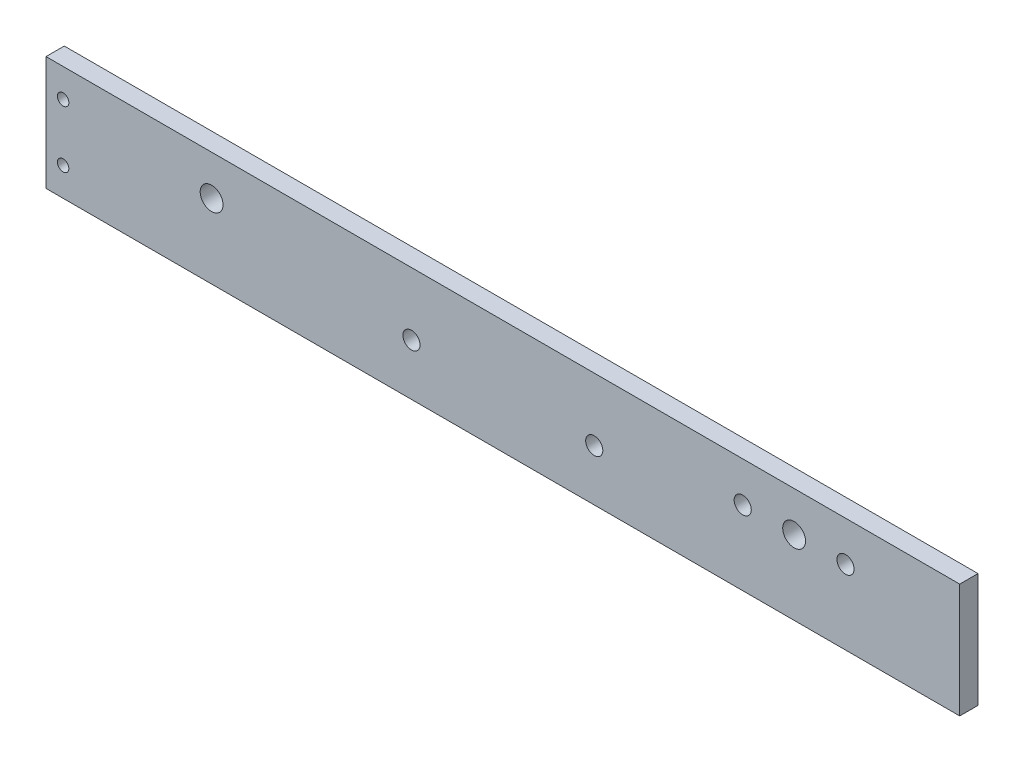
ISO-10303-21;
HEADER;
FILE_DESCRIPTION(('STEP AP214'),'2;1');
FILE_NAME('part.step','',(''),(''),'','','');
FILE_SCHEMA(('AUTOMOTIVE_DESIGN { 1 0 10303 214 1 1 1 1 }'));
ENDSEC;
DATA;
#1=APPLICATION_CONTEXT('core data for automotive mechanical design processes');
#2=APPLICATION_PROTOCOL_DEFINITION('international standard','automotive_design',2000,#1);
#3=PRODUCT_CONTEXT('',#1,'mechanical');
#4=PRODUCT('Part','Part','',(#3));
#5=PRODUCT_RELATED_PRODUCT_CATEGORY('part','',(#4));
#6=PRODUCT_DEFINITION_FORMATION('','',#4);
#7=PRODUCT_DEFINITION_CONTEXT('part definition',#1,'design');
#8=PRODUCT_DEFINITION('design','',#6,#7);
#9=PRODUCT_DEFINITION_SHAPE('','',#8);
#10=(LENGTH_UNIT() NAMED_UNIT(*) SI_UNIT(.MILLI.,.METRE.));
#11=(NAMED_UNIT(*) PLANE_ANGLE_UNIT() SI_UNIT($,.RADIAN.));
#12=(NAMED_UNIT(*) SI_UNIT($,.STERADIAN.) SOLID_ANGLE_UNIT());
#13=UNCERTAINTY_MEASURE_WITH_UNIT(LENGTH_MEASURE(1.E-05),#10,'distance_accuracy_value','');
#14=(GEOMETRIC_REPRESENTATION_CONTEXT(3) GLOBAL_UNCERTAINTY_ASSIGNED_CONTEXT((#13)) GLOBAL_UNIT_ASSIGNED_CONTEXT((#10,
#11,#12)) REPRESENTATION_CONTEXT('',''));
#15=CARTESIAN_POINT('',(0.,0.,0.));
#16=DIRECTION('',(0.,0.,1.));
#17=DIRECTION('',(1.,0.,0.));
#18=AXIS2_PLACEMENT_3D('',#15,#16,#17);
#19=CARTESIAN_POINT('',(0.,0.,6.8));
#20=DIRECTION('',(1.,0.,0.));
#21=DIRECTION('',(0.,0.,-1.));
#22=AXIS2_PLACEMENT_3D('',#19,#20,#21);
#23=PLANE('',#22);
#24=DIRECTION('',(0.,1.,0.));
#25=VECTOR('',#24,1.);
#26=CARTESIAN_POINT('',(0.,0.,10.));
#27=LINE('',#26,#25);
#28=CARTESIAN_POINT('',(0.,-20.,10.));
#29=VERTEX_POINT('',#28);
#30=CARTESIAN_POINT('',(0.,0.,10.));
#31=VERTEX_POINT('',#30);
#32=EDGE_CURVE('E103',#29,#31,#27,.T.);
#33=ORIENTED_EDGE('',*,*,#32,.T.);
#34=DIRECTION('',(0.,0.,1.));
#35=VECTOR('',#34,1.);
#36=CARTESIAN_POINT('',(0.,0.,6.8));
#37=LINE('',#36,#35);
#38=CARTESIAN_POINT('',(0.,0.,6.8));
#39=VERTEX_POINT('',#38);
#40=EDGE_CURVE('E11',#39,#31,#37,.T.);
#41=ORIENTED_EDGE('',*,*,#40,.F.);
#42=DIRECTION('',(0.,1.,0.));
#43=VECTOR('',#42,1.);
#44=CARTESIAN_POINT('',(0.,0.,6.8));
#45=LINE('',#44,#43);
#46=CARTESIAN_POINT('',(0.,-20.,6.8));
#47=VERTEX_POINT('',#46);
#48=EDGE_CURVE('E90',#47,#39,#45,.T.);
#49=ORIENTED_EDGE('',*,*,#48,.F.);
#50=DIRECTION('',(0.,0.,1.));
#51=VECTOR('',#50,1.);
#52=CARTESIAN_POINT('',(0.,-20.,6.8));
#53=LINE('',#52,#51);
#54=EDGE_CURVE('E99',#47,#29,#53,.T.);
#55=ORIENTED_EDGE('',*,*,#54,.T.);
#56=EDGE_LOOP('',(#33,#41,#49,#55));
#57=FACE_BOUND('',#56,.T.);
#58=ADVANCED_FACE('F37',(#57),#23,.F.);
#59=CARTESIAN_POINT('',(0.,0.,6.8));
#60=DIRECTION('',(0.,-1.,0.));
#61=DIRECTION('',(0.,0.,-1.));
#62=AXIS2_PLACEMENT_3D('',#59,#60,#61);
#63=PLANE('',#62);
#64=DIRECTION('',(1.,0.,0.));
#65=VECTOR('',#64,1.);
#66=CARTESIAN_POINT('',(0.,0.,10.));
#67=LINE('',#66,#65);
#68=CARTESIAN_POINT('',(160.,0.,10.));
#69=VERTEX_POINT('',#68);
#70=EDGE_CURVE('E94',#31,#69,#67,.T.);
#71=ORIENTED_EDGE('',*,*,#70,.T.);
#72=DIRECTION('',(0.,0.,1.));
#73=VECTOR('',#72,1.);
#74=CARTESIAN_POINT('',(160.,0.,6.8));
#75=LINE('',#74,#73);
#76=CARTESIAN_POINT('',(160.,0.,6.8));
#77=VERTEX_POINT('',#76);
#78=EDGE_CURVE('E46',#77,#69,#75,.T.);
#79=ORIENTED_EDGE('',*,*,#78,.F.);
#80=DIRECTION('',(1.,0.,0.));
#81=VECTOR('',#80,1.);
#82=CARTESIAN_POINT('',(0.,0.,6.8));
#83=LINE('',#82,#81);
#84=EDGE_CURVE('E85',#39,#77,#83,.T.);
#85=ORIENTED_EDGE('',*,*,#84,.F.);
#86=ORIENTED_EDGE('',*,*,#40,.T.);
#87=EDGE_LOOP('',(#71,#79,#85,#86));
#88=FACE_BOUND('',#87,.T.);
#89=ADVANCED_FACE('F93',(#88),#63,.F.);
#90=CARTESIAN_POINT('',(160.,0.,6.8));
#91=DIRECTION('',(-1.,0.,0.));
#92=DIRECTION('',(0.,0.,1.));
#93=AXIS2_PLACEMENT_3D('',#90,#91,#92);
#94=PLANE('',#93);
#95=DIRECTION('',(0.,-1.,0.));
#96=VECTOR('',#95,1.);
#97=CARTESIAN_POINT('',(160.,0.,10.));
#98=LINE('',#97,#96);
#99=CARTESIAN_POINT('',(160.,-20.,10.));
#100=VERTEX_POINT('',#99);
#101=EDGE_CURVE('E72',#69,#100,#98,.T.);
#102=ORIENTED_EDGE('',*,*,#101,.T.);
#103=DIRECTION('',(0.,0.,1.));
#104=VECTOR('',#103,1.);
#105=CARTESIAN_POINT('',(160.,-20.,6.8));
#106=LINE('',#105,#104);
#107=CARTESIAN_POINT('',(160.,-20.,6.8));
#108=VERTEX_POINT('',#107);
#109=EDGE_CURVE('E95',#108,#100,#106,.T.);
#110=ORIENTED_EDGE('',*,*,#109,.F.);
#111=DIRECTION('',(0.,-1.,0.));
#112=VECTOR('',#111,1.);
#113=CARTESIAN_POINT('',(160.,0.,6.8));
#114=LINE('',#113,#112);
#115=EDGE_CURVE('E88',#77,#108,#114,.T.);
#116=ORIENTED_EDGE('',*,*,#115,.F.);
#117=ORIENTED_EDGE('',*,*,#78,.T.);
#118=EDGE_LOOP('',(#102,#110,#116,#117));
#119=FACE_BOUND('',#118,.T.);
#120=ADVANCED_FACE('F97',(#119),#94,.F.);
#121=CARTESIAN_POINT('',(0.,-20.,6.8));
#122=DIRECTION('',(0.,1.,0.));
#123=DIRECTION('',(0.,0.,1.));
#124=AXIS2_PLACEMENT_3D('',#121,#122,#123);
#125=PLANE('',#124);
#126=DIRECTION('',(-1.,0.,0.));
#127=VECTOR('',#126,1.);
#128=CARTESIAN_POINT('',(0.,-20.,10.));
#129=LINE('',#128,#127);
#130=EDGE_CURVE('E78',#100,#29,#129,.T.);
#131=ORIENTED_EDGE('',*,*,#130,.T.);
#132=ORIENTED_EDGE('',*,*,#54,.F.);
#133=DIRECTION('',(-1.,0.,0.));
#134=VECTOR('',#133,1.);
#135=CARTESIAN_POINT('',(0.,-20.,6.8));
#136=LINE('',#135,#134);
#137=EDGE_CURVE('E55',#108,#47,#136,.T.);
#138=ORIENTED_EDGE('',*,*,#137,.F.);
#139=ORIENTED_EDGE('',*,*,#109,.T.);
#140=EDGE_LOOP('',(#131,#132,#138,#139));
#141=FACE_BOUND('',#140,.T.);
#142=ADVANCED_FACE('F177',(#141),#125,.F.);
#143=CARTESIAN_POINT('',(0.,0.,6.8));
#144=DIRECTION('',(0.,0.,1.));
#145=DIRECTION('',(1.,0.,0.));
#146=AXIS2_PLACEMENT_3D('',#143,#144,#145);
#147=PLANE('',#146);
#148=CARTESIAN_POINT('',(140.,-6.99999999999999,6.8));
#149=DIRECTION('',(0.,0.,1.));
#150=DIRECTION('',(1.,0.,0.));
#151=AXIS2_PLACEMENT_3D('',#148,#149,#150);
#152=CIRCLE('',#151,1.5);
#153=CARTESIAN_POINT('',(141.5,-6.99999999999999,6.8));
#154=VERTEX_POINT('',#153);
#155=EDGE_CURVE('E130',#154,#154,#152,.T.);
#156=ORIENTED_EDGE('',*,*,#155,.T.);
#157=EDGE_LOOP('',(#156));
#158=FACE_BOUND('',#157,.T.);
#159=CARTESIAN_POINT('',(122.,-6.99999999999999,6.8));
#160=DIRECTION('',(0.,0.,1.));
#161=DIRECTION('',(1.,0.,0.));
#162=AXIS2_PLACEMENT_3D('',#159,#160,#161);
#163=CIRCLE('',#162,1.5);
#164=CARTESIAN_POINT('',(123.5,-6.99999999999999,6.8));
#165=VERTEX_POINT('',#164);
#166=EDGE_CURVE('E289',#165,#165,#163,.T.);
#167=ORIENTED_EDGE('',*,*,#166,.T.);
#168=EDGE_LOOP('',(#167));
#169=FACE_BOUND('',#168,.T.);
#170=CARTESIAN_POINT('',(2.99999999999999,-15.,6.8));
#171=DIRECTION('',(0.,0.,1.));
#172=DIRECTION('',(1.,0.,0.));
#173=AXIS2_PLACEMENT_3D('',#170,#171,#172);
#174=CIRCLE('',#173,1.);
#175=CARTESIAN_POINT('',(3.99999999999999,-15.,6.8));
#176=VERTEX_POINT('',#175);
#177=EDGE_CURVE('E119',#176,#176,#174,.T.);
#178=ORIENTED_EDGE('',*,*,#177,.T.);
#179=EDGE_LOOP('',(#178));
#180=FACE_BOUND('',#179,.T.);
#181=CARTESIAN_POINT('',(3.,-5.,6.8));
#182=DIRECTION('',(0.,0.,1.));
#183=DIRECTION('',(1.,0.,0.));
#184=AXIS2_PLACEMENT_3D('',#181,#182,#183);
#185=CIRCLE('',#184,1.);
#186=CARTESIAN_POINT('',(4.,-5.,6.8));
#187=VERTEX_POINT('',#186);
#188=EDGE_CURVE('E125',#187,#187,#185,.T.);
#189=ORIENTED_EDGE('',*,*,#188,.T.);
#190=EDGE_LOOP('',(#189));
#191=FACE_BOUND('',#190,.T.);
#192=CARTESIAN_POINT('',(96.,-11.,6.8));
#193=DIRECTION('',(0.,0.,1.));
#194=DIRECTION('',(1.,0.,0.));
#195=AXIS2_PLACEMENT_3D('',#192,#193,#194);
#196=CIRCLE('',#195,1.5);
#197=CARTESIAN_POINT('',(97.5,-11.,6.8));
#198=VERTEX_POINT('',#197);
#199=EDGE_CURVE('E143',#198,#198,#196,.T.);
#200=ORIENTED_EDGE('',*,*,#199,.T.);
#201=EDGE_LOOP('',(#200));
#202=FACE_BOUND('',#201,.T.);
#203=CARTESIAN_POINT('',(64.,-11.,6.8));
#204=DIRECTION('',(0.,0.,1.));
#205=DIRECTION('',(1.,0.,0.));
#206=AXIS2_PLACEMENT_3D('',#203,#204,#205);
#207=CIRCLE('',#206,1.5);
#208=CARTESIAN_POINT('',(65.5,-11.,6.8));
#209=VERTEX_POINT('',#208);
#210=EDGE_CURVE('E138',#209,#209,#207,.T.);
#211=ORIENTED_EDGE('',*,*,#210,.T.);
#212=EDGE_LOOP('',(#211));
#213=FACE_BOUND('',#212,.T.);
#214=CARTESIAN_POINT('',(131.,-7.,6.8));
#215=DIRECTION('',(0.,0.,1.));
#216=DIRECTION('',(1.,0.,0.));
#217=AXIS2_PLACEMENT_3D('',#214,#215,#216);
#218=CIRCLE('',#217,2.);
#219=CARTESIAN_POINT('',(133.,-7.,6.8));
#220=VERTEX_POINT('',#219);
#221=EDGE_CURVE('E115',#220,#220,#218,.T.);
#222=ORIENTED_EDGE('',*,*,#221,.T.);
#223=EDGE_LOOP('',(#222));
#224=FACE_BOUND('',#223,.T.);
#225=CARTESIAN_POINT('',(29.,-7.,6.8));
#226=DIRECTION('',(0.,0.,1.));
#227=DIRECTION('',(1.,0.,0.));
#228=AXIS2_PLACEMENT_3D('',#225,#226,#227);
#229=CIRCLE('',#228,2.);
#230=CARTESIAN_POINT('',(31.,-7.,6.8));
#231=VERTEX_POINT('',#230);
#232=EDGE_CURVE('E146',#231,#231,#229,.T.);
#233=ORIENTED_EDGE('',*,*,#232,.T.);
#234=EDGE_LOOP('',(#233));
#235=FACE_BOUND('',#234,.T.);
#236=ORIENTED_EDGE('',*,*,#48,.T.);
#237=ORIENTED_EDGE('',*,*,#84,.T.);
#238=ORIENTED_EDGE('',*,*,#115,.T.);
#239=ORIENTED_EDGE('',*,*,#137,.T.);
#240=EDGE_LOOP('',(#236,#237,#238,#239));
#241=FACE_BOUND('',#240,.T.);
#242=ADVANCED_FACE('F86',(#158,#169,#180,#191,#202,#213,#224,#235,#241),#147,.F.);
#243=CARTESIAN_POINT('',(0.,0.,10.));
#244=DIRECTION('',(0.,0.,1.));
#245=DIRECTION('',(1.,0.,0.));
#246=AXIS2_PLACEMENT_3D('',#243,#244,#245);
#247=PLANE('',#246);
#248=CARTESIAN_POINT('',(140.,-6.99999999999999,10.));
#249=DIRECTION('',(0.,0.,1.));
#250=DIRECTION('',(1.,0.,0.));
#251=AXIS2_PLACEMENT_3D('',#248,#249,#250);
#252=CIRCLE('',#251,1.5);
#253=CARTESIAN_POINT('',(141.5,-6.99999999999999,10.));
#254=VERTEX_POINT('',#253);
#255=EDGE_CURVE('E286',#254,#254,#252,.T.);
#256=ORIENTED_EDGE('',*,*,#255,.F.);
#257=EDGE_LOOP('',(#256));
#258=FACE_BOUND('',#257,.T.);
#259=CARTESIAN_POINT('',(122.,-6.99999999999999,10.));
#260=DIRECTION('',(0.,0.,1.));
#261=DIRECTION('',(1.,0.,0.));
#262=AXIS2_PLACEMENT_3D('',#259,#260,#261);
#263=CIRCLE('',#262,1.5);
#264=CARTESIAN_POINT('',(123.5,-6.99999999999999,10.));
#265=VERTEX_POINT('',#264);
#266=EDGE_CURVE('E293',#265,#265,#263,.T.);
#267=ORIENTED_EDGE('',*,*,#266,.F.);
#268=EDGE_LOOP('',(#267));
#269=FACE_BOUND('',#268,.T.);
#270=CARTESIAN_POINT('',(2.99999999999999,-15.,10.));
#271=DIRECTION('',(0.,0.,1.));
#272=DIRECTION('',(1.,0.,0.));
#273=AXIS2_PLACEMENT_3D('',#270,#271,#272);
#274=CIRCLE('',#273,1.);
#275=CARTESIAN_POINT('',(3.99999999999999,-15.,10.));
#276=VERTEX_POINT('',#275);
#277=EDGE_CURVE('E40',#276,#276,#274,.T.);
#278=ORIENTED_EDGE('',*,*,#277,.F.);
#279=EDGE_LOOP('',(#278));
#280=FACE_BOUND('',#279,.T.);
#281=CARTESIAN_POINT('',(3.,-5.,10.));
#282=DIRECTION('',(0.,0.,1.));
#283=DIRECTION('',(1.,0.,0.));
#284=AXIS2_PLACEMENT_3D('',#281,#282,#283);
#285=CIRCLE('',#284,1.);
#286=CARTESIAN_POINT('',(4.,-5.,10.));
#287=VERTEX_POINT('',#286);
#288=EDGE_CURVE('E117',#287,#287,#285,.T.);
#289=ORIENTED_EDGE('',*,*,#288,.F.);
#290=EDGE_LOOP('',(#289));
#291=FACE_BOUND('',#290,.T.);
#292=CARTESIAN_POINT('',(96.,-11.,10.));
#293=DIRECTION('',(0.,0.,1.));
#294=DIRECTION('',(1.,0.,0.));
#295=AXIS2_PLACEMENT_3D('',#292,#293,#294);
#296=CIRCLE('',#295,1.5);
#297=CARTESIAN_POINT('',(97.5,-11.,10.));
#298=VERTEX_POINT('',#297);
#299=EDGE_CURVE('E135',#298,#298,#296,.T.);
#300=ORIENTED_EDGE('',*,*,#299,.F.);
#301=EDGE_LOOP('',(#300));
#302=FACE_BOUND('',#301,.T.);
#303=CARTESIAN_POINT('',(64.,-11.,10.));
#304=DIRECTION('',(0.,0.,1.));
#305=DIRECTION('',(1.,0.,0.));
#306=AXIS2_PLACEMENT_3D('',#303,#304,#305);
#307=CIRCLE('',#306,1.5);
#308=CARTESIAN_POINT('',(65.5,-11.,10.));
#309=VERTEX_POINT('',#308);
#310=EDGE_CURVE('E123',#309,#309,#307,.T.);
#311=ORIENTED_EDGE('',*,*,#310,.F.);
#312=EDGE_LOOP('',(#311));
#313=FACE_BOUND('',#312,.T.);
#314=CARTESIAN_POINT('',(131.,-7.,10.));
#315=DIRECTION('',(0.,0.,1.));
#316=DIRECTION('',(1.,0.,0.));
#317=AXIS2_PLACEMENT_3D('',#314,#315,#316);
#318=CIRCLE('',#317,2.);
#319=CARTESIAN_POINT('',(133.,-7.,10.));
#320=VERTEX_POINT('',#319);
#321=EDGE_CURVE('E106',#320,#320,#318,.T.);
#322=ORIENTED_EDGE('',*,*,#321,.F.);
#323=EDGE_LOOP('',(#322));
#324=FACE_BOUND('',#323,.T.);
#325=CARTESIAN_POINT('',(29.,-7.,10.));
#326=DIRECTION('',(0.,0.,1.));
#327=DIRECTION('',(1.,0.,0.));
#328=AXIS2_PLACEMENT_3D('',#325,#326,#327);
#329=CIRCLE('',#328,2.);
#330=CARTESIAN_POINT('',(31.,-7.,10.));
#331=VERTEX_POINT('',#330);
#332=EDGE_CURVE('E112',#331,#331,#329,.T.);
#333=ORIENTED_EDGE('',*,*,#332,.F.);
#334=EDGE_LOOP('',(#333));
#335=FACE_BOUND('',#334,.T.);
#336=ORIENTED_EDGE('',*,*,#32,.F.);
#337=ORIENTED_EDGE('',*,*,#130,.F.);
#338=ORIENTED_EDGE('',*,*,#101,.F.);
#339=ORIENTED_EDGE('',*,*,#70,.F.);
#340=EDGE_LOOP('',(#336,#337,#338,#339));
#341=FACE_BOUND('',#340,.T.);
#342=ADVANCED_FACE('F156',(#258,#269,#280,#291,#302,#313,#324,#335,#341),#247,.T.);
#343=CARTESIAN_POINT('',(29.,-7.,6.8));
#344=DIRECTION('',(0.,0.,1.));
#345=DIRECTION('',(1.,0.,0.));
#346=AXIS2_PLACEMENT_3D('',#343,#344,#345);
#347=CYLINDRICAL_SURFACE('',#346,2.);
#348=CARTESIAN_POINT('',(31.,-7.,10.));
#349=CARTESIAN_POINT('',(31.,-7.,9.96666666666667));
#350=CARTESIAN_POINT('',(31.,-7.,9.93333333333333));
#351=CARTESIAN_POINT('',(31.,-7.,9.86666666666667));
#352=CARTESIAN_POINT('',(31.,-7.,9.83333333333333));
#353=CARTESIAN_POINT('',(31.,-7.,9.76666666666667));
#354=CARTESIAN_POINT('',(31.,-7.,9.73333333333333));
#355=CARTESIAN_POINT('',(31.,-7.,9.66666666666667));
#356=CARTESIAN_POINT('',(31.,-7.,9.63333333333333));
#357=CARTESIAN_POINT('',(31.,-7.,9.56666666666667));
#358=CARTESIAN_POINT('',(31.,-7.,9.53333333333333));
#359=CARTESIAN_POINT('',(31.,-7.,9.46666666666667));
#360=CARTESIAN_POINT('',(31.,-7.,9.43333333333333));
#361=CARTESIAN_POINT('',(31.,-7.,9.36666666666667));
#362=CARTESIAN_POINT('',(31.,-7.,9.33333333333333));
#363=CARTESIAN_POINT('',(31.,-7.,9.26666666666667));
#364=CARTESIAN_POINT('',(31.,-7.,9.23333333333333));
#365=CARTESIAN_POINT('',(31.,-7.,9.16666666666667));
#366=CARTESIAN_POINT('',(31.,-7.,9.13333333333333));
#367=CARTESIAN_POINT('',(31.,-7.,9.06666666666667));
#368=CARTESIAN_POINT('',(31.,-7.,9.03333333333333));
#369=CARTESIAN_POINT('',(31.,-7.,8.96666666666667));
#370=CARTESIAN_POINT('',(31.,-7.,8.93333333333333));
#371=CARTESIAN_POINT('',(31.,-7.,8.86666666666667));
#372=CARTESIAN_POINT('',(31.,-7.,8.83333333333333));
#373=CARTESIAN_POINT('',(31.,-7.,8.76666666666667));
#374=CARTESIAN_POINT('',(31.,-7.,8.73333333333333));
#375=CARTESIAN_POINT('',(31.,-7.,8.66666666666667));
#376=CARTESIAN_POINT('',(31.,-7.,8.63333333333333));
#377=CARTESIAN_POINT('',(31.,-7.,8.56666666666667));
#378=CARTESIAN_POINT('',(31.,-7.,8.53333333333333));
#379=CARTESIAN_POINT('',(31.,-7.,8.46666666666667));
#380=CARTESIAN_POINT('',(31.,-7.,8.43333333333333));
#381=CARTESIAN_POINT('',(31.,-7.,8.36666666666667));
#382=CARTESIAN_POINT('',(31.,-7.,8.33333333333333));
#383=CARTESIAN_POINT('',(31.,-7.,8.26666666666667));
#384=CARTESIAN_POINT('',(31.,-7.,8.23333333333333));
#385=CARTESIAN_POINT('',(31.,-7.,8.16666666666667));
#386=CARTESIAN_POINT('',(31.,-7.,8.13333333333333));
#387=CARTESIAN_POINT('',(31.,-7.,8.06666666666667));
#388=CARTESIAN_POINT('',(31.,-7.,8.03333333333333));
#389=CARTESIAN_POINT('',(31.,-7.,7.96666666666667));
#390=CARTESIAN_POINT('',(31.,-7.,7.93333333333333));
#391=CARTESIAN_POINT('',(31.,-7.,7.86666666666667));
#392=CARTESIAN_POINT('',(31.,-7.,7.83333333333333));
#393=CARTESIAN_POINT('',(31.,-7.,7.76666666666667));
#394=CARTESIAN_POINT('',(31.,-7.,7.73333333333333));
#395=CARTESIAN_POINT('',(31.,-7.,7.66666666666667));
#396=CARTESIAN_POINT('',(31.,-7.,7.63333333333333));
#397=CARTESIAN_POINT('',(31.,-7.,7.56666666666667));
#398=CARTESIAN_POINT('',(31.,-7.,7.53333333333333));
#399=CARTESIAN_POINT('',(31.,-7.,7.46666666666667));
#400=CARTESIAN_POINT('',(31.,-7.,7.43333333333333));
#401=CARTESIAN_POINT('',(31.,-7.,7.36666666666667));
#402=CARTESIAN_POINT('',(31.,-7.,7.33333333333333));
#403=CARTESIAN_POINT('',(31.,-7.,7.26666666666667));
#404=CARTESIAN_POINT('',(31.,-7.,7.23333333333333));
#405=CARTESIAN_POINT('',(31.,-7.,7.16666666666667));
#406=CARTESIAN_POINT('',(31.,-7.,7.13333333333333));
#407=CARTESIAN_POINT('',(31.,-7.,7.06666666666667));
#408=CARTESIAN_POINT('',(31.,-7.,7.03333333333333));
#409=CARTESIAN_POINT('',(31.,-7.,6.96666666666667));
#410=CARTESIAN_POINT('',(31.,-7.,6.93333333333333));
#411=CARTESIAN_POINT('',(31.,-7.,6.86666666666667));
#412=CARTESIAN_POINT('',(31.,-7.,6.83333333333333));
#413=CARTESIAN_POINT('',(31.,-7.,6.8));
#414=B_SPLINE_CURVE_WITH_KNOTS('',3,(#348,#349,#350,#351,#352,#353,#354,#355,#356,#357,#358,
#359,#360,#361,#362,#363,#364,#365,#366,#367,#368,#369,#370,#371,#372,#373,#374,#375,#376,#377,
#378,#379,#380,#381,#382,#383,#384,#385,#386,#387,#388,#389,#390,#391,#392,#393,#394,#395,#396,
#397,#398,#399,#400,#401,#402,#403,#404,#405,#406,#407,#408,#409,#410,#411,#412,#413),
.UNSPECIFIED.,.F.,.F.,(4,2,2,2,2,2,2,2,2,2,2,2,2,2,2,2,2,2,2,2,2,2,2,2,2,2,2,2,2,2,2,2,4),(0.,
0.100000000000001,0.200000000000001,0.3,0.400000000000001,0.5,0.6,0.700000000000001,0.8,0.9,1.,
1.1,1.2,1.3,1.4,1.5,1.6,1.7,1.8,1.9,2.,2.1,2.2,2.3,2.4,2.5,2.6,2.7,2.8,2.9,3.,3.1,3.2),.UNSPECIFIED.);
#415=EDGE_CURVE('BSEAM153',#331,#231,#414,.T.);
#416=ORIENTED_EDGE('',*,*,#332,.T.);
#417=ORIENTED_EDGE('',*,*,#232,.F.);
#418=ORIENTED_EDGE('',*,*,#415,.T.);
#419=ORIENTED_EDGE('',*,*,#415,.F.);
#420=EDGE_LOOP('',(#416,#418,#417,#419));
#421=FACE_BOUND('',#420,.T.);
#422=ADVANCED_FACE('F153',(#421),#347,.F.);
#423=CARTESIAN_POINT('',(131.,-7.,6.8));
#424=DIRECTION('',(0.,0.,1.));
#425=DIRECTION('',(1.,0.,0.));
#426=AXIS2_PLACEMENT_3D('',#423,#424,#425);
#427=CYLINDRICAL_SURFACE('',#426,2.);
#428=CARTESIAN_POINT('',(133.,-7.,10.));
#429=CARTESIAN_POINT('',(133.,-7.,9.96666666666667));
#430=CARTESIAN_POINT('',(133.,-7.,9.93333333333333));
#431=CARTESIAN_POINT('',(133.,-7.,9.86666666666667));
#432=CARTESIAN_POINT('',(133.,-7.,9.83333333333333));
#433=CARTESIAN_POINT('',(133.,-7.,9.76666666666667));
#434=CARTESIAN_POINT('',(133.,-7.,9.73333333333333));
#435=CARTESIAN_POINT('',(133.,-7.,9.66666666666667));
#436=CARTESIAN_POINT('',(133.,-7.,9.63333333333333));
#437=CARTESIAN_POINT('',(133.,-7.,9.56666666666667));
#438=CARTESIAN_POINT('',(133.,-7.,9.53333333333333));
#439=CARTESIAN_POINT('',(133.,-7.,9.46666666666667));
#440=CARTESIAN_POINT('',(133.,-7.,9.43333333333333));
#441=CARTESIAN_POINT('',(133.,-7.,9.36666666666667));
#442=CARTESIAN_POINT('',(133.,-7.,9.33333333333333));
#443=CARTESIAN_POINT('',(133.,-7.,9.26666666666667));
#444=CARTESIAN_POINT('',(133.,-7.,9.23333333333333));
#445=CARTESIAN_POINT('',(133.,-7.,9.16666666666667));
#446=CARTESIAN_POINT('',(133.,-7.,9.13333333333333));
#447=CARTESIAN_POINT('',(133.,-7.,9.06666666666667));
#448=CARTESIAN_POINT('',(133.,-7.,9.03333333333333));
#449=CARTESIAN_POINT('',(133.,-7.,8.96666666666667));
#450=CARTESIAN_POINT('',(133.,-7.,8.93333333333333));
#451=CARTESIAN_POINT('',(133.,-7.,8.86666666666667));
#452=CARTESIAN_POINT('',(133.,-7.,8.83333333333333));
#453=CARTESIAN_POINT('',(133.,-7.,8.76666666666667));
#454=CARTESIAN_POINT('',(133.,-7.,8.73333333333333));
#455=CARTESIAN_POINT('',(133.,-7.,8.66666666666667));
#456=CARTESIAN_POINT('',(133.,-7.,8.63333333333333));
#457=CARTESIAN_POINT('',(133.,-7.,8.56666666666667));
#458=CARTESIAN_POINT('',(133.,-7.,8.53333333333333));
#459=CARTESIAN_POINT('',(133.,-7.,8.46666666666667));
#460=CARTESIAN_POINT('',(133.,-7.,8.43333333333333));
#461=CARTESIAN_POINT('',(133.,-7.,8.36666666666667));
#462=CARTESIAN_POINT('',(133.,-7.,8.33333333333333));
#463=CARTESIAN_POINT('',(133.,-7.,8.26666666666667));
#464=CARTESIAN_POINT('',(133.,-7.,8.23333333333333));
#465=CARTESIAN_POINT('',(133.,-7.,8.16666666666667));
#466=CARTESIAN_POINT('',(133.,-7.,8.13333333333333));
#467=CARTESIAN_POINT('',(133.,-7.,8.06666666666667));
#468=CARTESIAN_POINT('',(133.,-7.,8.03333333333333));
#469=CARTESIAN_POINT('',(133.,-7.,7.96666666666667));
#470=CARTESIAN_POINT('',(133.,-7.,7.93333333333333));
#471=CARTESIAN_POINT('',(133.,-7.,7.86666666666667));
#472=CARTESIAN_POINT('',(133.,-7.,7.83333333333333));
#473=CARTESIAN_POINT('',(133.,-7.,7.76666666666667));
#474=CARTESIAN_POINT('',(133.,-7.,7.73333333333333));
#475=CARTESIAN_POINT('',(133.,-7.,7.66666666666667));
#476=CARTESIAN_POINT('',(133.,-7.,7.63333333333333));
#477=CARTESIAN_POINT('',(133.,-7.,7.56666666666667));
#478=CARTESIAN_POINT('',(133.,-7.,7.53333333333333));
#479=CARTESIAN_POINT('',(133.,-7.,7.46666666666667));
#480=CARTESIAN_POINT('',(133.,-7.,7.43333333333333));
#481=CARTESIAN_POINT('',(133.,-7.,7.36666666666667));
#482=CARTESIAN_POINT('',(133.,-7.,7.33333333333333));
#483=CARTESIAN_POINT('',(133.,-7.,7.26666666666667));
#484=CARTESIAN_POINT('',(133.,-7.,7.23333333333333));
#485=CARTESIAN_POINT('',(133.,-7.,7.16666666666667));
#486=CARTESIAN_POINT('',(133.,-7.,7.13333333333333));
#487=CARTESIAN_POINT('',(133.,-7.,7.06666666666667));
#488=CARTESIAN_POINT('',(133.,-7.,7.03333333333333));
#489=CARTESIAN_POINT('',(133.,-7.,6.96666666666667));
#490=CARTESIAN_POINT('',(133.,-7.,6.93333333333333));
#491=CARTESIAN_POINT('',(133.,-7.,6.86666666666667));
#492=CARTESIAN_POINT('',(133.,-7.,6.83333333333333));
#493=CARTESIAN_POINT('',(133.,-7.,6.8));
#494=B_SPLINE_CURVE_WITH_KNOTS('',3,(#428,#429,#430,#431,#432,#433,#434,#435,#436,#437,#438,
#439,#440,#441,#442,#443,#444,#445,#446,#447,#448,#449,#450,#451,#452,#453,#454,#455,#456,#457,
#458,#459,#460,#461,#462,#463,#464,#465,#466,#467,#468,#469,#470,#471,#472,#473,#474,#475,#476,
#477,#478,#479,#480,#481,#482,#483,#484,#485,#486,#487,#488,#489,#490,#491,#492,#493),
.UNSPECIFIED.,.F.,.F.,(4,2,2,2,2,2,2,2,2,2,2,2,2,2,2,2,2,2,2,2,2,2,2,2,2,2,2,2,2,2,2,2,4),(0.,
0.100000000000001,0.200000000000001,0.3,0.400000000000001,0.5,0.6,0.700000000000001,0.8,0.9,1.,
1.1,1.2,1.3,1.4,1.5,1.6,1.7,1.8,1.9,2.,2.1,2.2,2.3,2.4,2.5,2.6,2.7,2.8,2.9,3.,3.1,3.2),.UNSPECIFIED.);
#495=EDGE_CURVE('BSEAM155',#320,#220,#494,.T.);
#496=ORIENTED_EDGE('',*,*,#321,.T.);
#497=ORIENTED_EDGE('',*,*,#221,.F.);
#498=ORIENTED_EDGE('',*,*,#495,.T.);
#499=ORIENTED_EDGE('',*,*,#495,.F.);
#500=EDGE_LOOP('',(#496,#498,#497,#499));
#501=FACE_BOUND('',#500,.T.);
#502=ADVANCED_FACE('F155',(#501),#427,.F.);
#503=CARTESIAN_POINT('',(64.,-11.,0.));
#504=DIRECTION('',(0.,0.,1.));
#505=DIRECTION('',(1.,0.,0.));
#506=AXIS2_PLACEMENT_3D('',#503,#504,#505);
#507=CYLINDRICAL_SURFACE('',#506,1.5);
#508=ORIENTED_EDGE('',*,*,#310,.T.);
#509=EDGE_LOOP('',(#508));
#510=FACE_BOUND('',#509,.T.);
#511=ORIENTED_EDGE('',*,*,#210,.F.);
#512=EDGE_LOOP('',(#511));
#513=FACE_BOUND('',#512,.T.);
#514=ADVANCED_FACE('F163',(#510,#513),#507,.F.);
#515=CARTESIAN_POINT('',(96.,-11.,0.));
#516=DIRECTION('',(0.,0.,1.));
#517=DIRECTION('',(1.,0.,0.));
#518=AXIS2_PLACEMENT_3D('',#515,#516,#517);
#519=CYLINDRICAL_SURFACE('',#518,1.5);
#520=ORIENTED_EDGE('',*,*,#299,.T.);
#521=EDGE_LOOP('',(#520));
#522=FACE_BOUND('',#521,.T.);
#523=ORIENTED_EDGE('',*,*,#199,.F.);
#524=EDGE_LOOP('',(#523));
#525=FACE_BOUND('',#524,.T.);
#526=ADVANCED_FACE('F230',(#522,#525),#519,.F.);
#527=CARTESIAN_POINT('',(3.,-5.,6.8));
#528=DIRECTION('',(0.,0.,1.));
#529=DIRECTION('',(1.,0.,0.));
#530=AXIS2_PLACEMENT_3D('',#527,#528,#529);
#531=CYLINDRICAL_SURFACE('',#530,1.);
#532=CARTESIAN_POINT('',(4.,-5.,10.));
#533=CARTESIAN_POINT('',(4.,-5.,9.96666666666667));
#534=CARTESIAN_POINT('',(4.,-5.,9.93333333333333));
#535=CARTESIAN_POINT('',(4.,-5.,9.86666666666667));
#536=CARTESIAN_POINT('',(4.,-5.,9.83333333333333));
#537=CARTESIAN_POINT('',(4.,-5.,9.76666666666667));
#538=CARTESIAN_POINT('',(4.,-5.,9.73333333333333));
#539=CARTESIAN_POINT('',(4.,-5.,9.66666666666667));
#540=CARTESIAN_POINT('',(4.,-5.,9.63333333333333));
#541=CARTESIAN_POINT('',(4.,-5.,9.56666666666667));
#542=CARTESIAN_POINT('',(4.,-5.,9.53333333333333));
#543=CARTESIAN_POINT('',(4.,-5.,9.46666666666667));
#544=CARTESIAN_POINT('',(4.,-5.,9.43333333333333));
#545=CARTESIAN_POINT('',(4.,-5.,9.36666666666667));
#546=CARTESIAN_POINT('',(4.,-5.,9.33333333333333));
#547=CARTESIAN_POINT('',(4.,-5.,9.26666666666667));
#548=CARTESIAN_POINT('',(4.,-5.,9.23333333333333));
#549=CARTESIAN_POINT('',(4.,-5.,9.16666666666667));
#550=CARTESIAN_POINT('',(4.,-5.,9.13333333333333));
#551=CARTESIAN_POINT('',(4.,-5.,9.06666666666667));
#552=CARTESIAN_POINT('',(4.,-5.,9.03333333333333));
#553=CARTESIAN_POINT('',(4.,-5.,8.96666666666667));
#554=CARTESIAN_POINT('',(4.,-5.,8.93333333333333));
#555=CARTESIAN_POINT('',(4.,-5.,8.86666666666667));
#556=CARTESIAN_POINT('',(4.,-5.,8.83333333333333));
#557=CARTESIAN_POINT('',(4.,-5.,8.76666666666667));
#558=CARTESIAN_POINT('',(4.,-5.,8.73333333333333));
#559=CARTESIAN_POINT('',(4.,-5.,8.66666666666667));
#560=CARTESIAN_POINT('',(4.,-5.,8.63333333333333));
#561=CARTESIAN_POINT('',(4.,-5.,8.56666666666667));
#562=CARTESIAN_POINT('',(4.,-5.,8.53333333333333));
#563=CARTESIAN_POINT('',(4.,-5.,8.46666666666667));
#564=CARTESIAN_POINT('',(4.,-5.,8.43333333333333));
#565=CARTESIAN_POINT('',(4.,-5.,8.36666666666667));
#566=CARTESIAN_POINT('',(4.,-5.,8.33333333333333));
#567=CARTESIAN_POINT('',(4.,-5.,8.26666666666667));
#568=CARTESIAN_POINT('',(4.,-5.,8.23333333333333));
#569=CARTESIAN_POINT('',(4.,-5.,8.16666666666667));
#570=CARTESIAN_POINT('',(4.,-5.,8.13333333333333));
#571=CARTESIAN_POINT('',(4.,-5.,8.06666666666667));
#572=CARTESIAN_POINT('',(4.,-5.,8.03333333333333));
#573=CARTESIAN_POINT('',(4.,-5.,7.96666666666667));
#574=CARTESIAN_POINT('',(4.,-5.,7.93333333333333));
#575=CARTESIAN_POINT('',(4.,-5.,7.86666666666667));
#576=CARTESIAN_POINT('',(4.,-5.,7.83333333333333));
#577=CARTESIAN_POINT('',(4.,-5.,7.76666666666667));
#578=CARTESIAN_POINT('',(4.,-5.,7.73333333333333));
#579=CARTESIAN_POINT('',(4.,-5.,7.66666666666667));
#580=CARTESIAN_POINT('',(4.,-5.,7.63333333333333));
#581=CARTESIAN_POINT('',(4.,-5.,7.56666666666667));
#582=CARTESIAN_POINT('',(4.,-5.,7.53333333333333));
#583=CARTESIAN_POINT('',(4.,-5.,7.46666666666667));
#584=CARTESIAN_POINT('',(4.,-5.,7.43333333333333));
#585=CARTESIAN_POINT('',(4.,-5.,7.36666666666667));
#586=CARTESIAN_POINT('',(4.,-5.,7.33333333333333));
#587=CARTESIAN_POINT('',(4.,-5.,7.26666666666667));
#588=CARTESIAN_POINT('',(4.,-5.,7.23333333333333));
#589=CARTESIAN_POINT('',(4.,-5.,7.16666666666667));
#590=CARTESIAN_POINT('',(4.,-5.,7.13333333333333));
#591=CARTESIAN_POINT('',(4.,-5.,7.06666666666667));
#592=CARTESIAN_POINT('',(4.,-5.,7.03333333333333));
#593=CARTESIAN_POINT('',(4.,-5.,6.96666666666667));
#594=CARTESIAN_POINT('',(4.,-5.,6.93333333333333));
#595=CARTESIAN_POINT('',(4.,-5.,6.86666666666667));
#596=CARTESIAN_POINT('',(4.,-5.,6.83333333333333));
#597=CARTESIAN_POINT('',(4.,-5.,6.8));
#598=B_SPLINE_CURVE_WITH_KNOTS('',3,(#532,#533,#534,#535,#536,#537,#538,#539,#540,#541,#542,
#543,#544,#545,#546,#547,#548,#549,#550,#551,#552,#553,#554,#555,#556,#557,#558,#559,#560,#561,
#562,#563,#564,#565,#566,#567,#568,#569,#570,#571,#572,#573,#574,#575,#576,#577,#578,#579,#580,
#581,#582,#583,#584,#585,#586,#587,#588,#589,#590,#591,#592,#593,#594,#595,#596,#597),
.UNSPECIFIED.,.F.,.F.,(4,2,2,2,2,2,2,2,2,2,2,2,2,2,2,2,2,2,2,2,2,2,2,2,2,2,2,2,2,2,2,2,4),(0.,
0.100000000000001,0.200000000000001,0.3,0.400000000000001,0.5,0.6,0.700000000000001,0.8,0.9,1.,
1.1,1.2,1.3,1.4,1.5,1.6,1.7,1.8,1.9,2.,2.1,2.2,2.3,2.4,2.5,2.6,2.7,2.8,2.9,3.,3.1,3.2),.UNSPECIFIED.);
#599=EDGE_CURVE('BSEAM239',#287,#187,#598,.T.);
#600=ORIENTED_EDGE('',*,*,#288,.T.);
#601=ORIENTED_EDGE('',*,*,#188,.F.);
#602=ORIENTED_EDGE('',*,*,#599,.T.);
#603=ORIENTED_EDGE('',*,*,#599,.F.);
#604=EDGE_LOOP('',(#600,#602,#601,#603));
#605=FACE_BOUND('',#604,.T.);
#606=ADVANCED_FACE('F239',(#605),#531,.F.);
#607=CARTESIAN_POINT('',(2.99999999999999,-15.,6.8));
#608=DIRECTION('',(0.,0.,1.));
#609=DIRECTION('',(1.,0.,0.));
#610=AXIS2_PLACEMENT_3D('',#607,#608,#609);
#611=CYLINDRICAL_SURFACE('',#610,1.);
#612=CARTESIAN_POINT('',(3.99999999999999,-15.,10.));
#613=CARTESIAN_POINT('',(3.99999999999999,-15.,9.96666666666667));
#614=CARTESIAN_POINT('',(3.99999999999999,-15.,9.93333333333333));
#615=CARTESIAN_POINT('',(3.99999999999999,-15.,9.86666666666667));
#616=CARTESIAN_POINT('',(3.99999999999999,-15.,9.83333333333333));
#617=CARTESIAN_POINT('',(3.99999999999999,-15.,9.76666666666667));
#618=CARTESIAN_POINT('',(3.99999999999999,-15.,9.73333333333333));
#619=CARTESIAN_POINT('',(3.99999999999999,-15.,9.66666666666667));
#620=CARTESIAN_POINT('',(3.99999999999999,-15.,9.63333333333333));
#621=CARTESIAN_POINT('',(3.99999999999999,-15.,9.56666666666667));
#622=CARTESIAN_POINT('',(3.99999999999999,-15.,9.53333333333333));
#623=CARTESIAN_POINT('',(3.99999999999999,-15.,9.46666666666667));
#624=CARTESIAN_POINT('',(3.99999999999999,-15.,9.43333333333333));
#625=CARTESIAN_POINT('',(3.99999999999999,-15.,9.36666666666667));
#626=CARTESIAN_POINT('',(3.99999999999999,-15.,9.33333333333333));
#627=CARTESIAN_POINT('',(3.99999999999999,-15.,9.26666666666667));
#628=CARTESIAN_POINT('',(3.99999999999999,-15.,9.23333333333333));
#629=CARTESIAN_POINT('',(3.99999999999999,-15.,9.16666666666667));
#630=CARTESIAN_POINT('',(3.99999999999999,-15.,9.13333333333333));
#631=CARTESIAN_POINT('',(3.99999999999999,-15.,9.06666666666667));
#632=CARTESIAN_POINT('',(3.99999999999999,-15.,9.03333333333333));
#633=CARTESIAN_POINT('',(3.99999999999999,-15.,8.96666666666667));
#634=CARTESIAN_POINT('',(3.99999999999999,-15.,8.93333333333333));
#635=CARTESIAN_POINT('',(3.99999999999999,-15.,8.86666666666667));
#636=CARTESIAN_POINT('',(3.99999999999999,-15.,8.83333333333333));
#637=CARTESIAN_POINT('',(3.99999999999999,-15.,8.76666666666667));
#638=CARTESIAN_POINT('',(3.99999999999999,-15.,8.73333333333333));
#639=CARTESIAN_POINT('',(3.99999999999999,-15.,8.66666666666667));
#640=CARTESIAN_POINT('',(3.99999999999999,-15.,8.63333333333333));
#641=CARTESIAN_POINT('',(3.99999999999999,-15.,8.56666666666667));
#642=CARTESIAN_POINT('',(3.99999999999999,-15.,8.53333333333333));
#643=CARTESIAN_POINT('',(3.99999999999999,-15.,8.46666666666667));
#644=CARTESIAN_POINT('',(3.99999999999999,-15.,8.43333333333333));
#645=CARTESIAN_POINT('',(3.99999999999999,-15.,8.36666666666667));
#646=CARTESIAN_POINT('',(3.99999999999999,-15.,8.33333333333333));
#647=CARTESIAN_POINT('',(3.99999999999999,-15.,8.26666666666667));
#648=CARTESIAN_POINT('',(3.99999999999999,-15.,8.23333333333333));
#649=CARTESIAN_POINT('',(3.99999999999999,-15.,8.16666666666667));
#650=CARTESIAN_POINT('',(3.99999999999999,-15.,8.13333333333333));
#651=CARTESIAN_POINT('',(3.99999999999999,-15.,8.06666666666667));
#652=CARTESIAN_POINT('',(3.99999999999999,-15.,8.03333333333333));
#653=CARTESIAN_POINT('',(3.99999999999999,-15.,7.96666666666667));
#654=CARTESIAN_POINT('',(3.99999999999999,-15.,7.93333333333333));
#655=CARTESIAN_POINT('',(3.99999999999999,-15.,7.86666666666667));
#656=CARTESIAN_POINT('',(3.99999999999999,-15.,7.83333333333333));
#657=CARTESIAN_POINT('',(3.99999999999999,-15.,7.76666666666667));
#658=CARTESIAN_POINT('',(3.99999999999999,-15.,7.73333333333333));
#659=CARTESIAN_POINT('',(3.99999999999999,-15.,7.66666666666667));
#660=CARTESIAN_POINT('',(3.99999999999999,-15.,7.63333333333333));
#661=CARTESIAN_POINT('',(3.99999999999999,-15.,7.56666666666667));
#662=CARTESIAN_POINT('',(3.99999999999999,-15.,7.53333333333333));
#663=CARTESIAN_POINT('',(3.99999999999999,-15.,7.46666666666667));
#664=CARTESIAN_POINT('',(3.99999999999999,-15.,7.43333333333333));
#665=CARTESIAN_POINT('',(3.99999999999999,-15.,7.36666666666667));
#666=CARTESIAN_POINT('',(3.99999999999999,-15.,7.33333333333333));
#667=CARTESIAN_POINT('',(3.99999999999999,-15.,7.26666666666667));
#668=CARTESIAN_POINT('',(3.99999999999999,-15.,7.23333333333333));
#669=CARTESIAN_POINT('',(3.99999999999999,-15.,7.16666666666667));
#670=CARTESIAN_POINT('',(3.99999999999999,-15.,7.13333333333333));
#671=CARTESIAN_POINT('',(3.99999999999999,-15.,7.06666666666667));
#672=CARTESIAN_POINT('',(3.99999999999999,-15.,7.03333333333333));
#673=CARTESIAN_POINT('',(3.99999999999999,-15.,6.96666666666667));
#674=CARTESIAN_POINT('',(3.99999999999999,-15.,6.93333333333333));
#675=CARTESIAN_POINT('',(3.99999999999999,-15.,6.86666666666667));
#676=CARTESIAN_POINT('',(3.99999999999999,-15.,6.83333333333333));
#677=CARTESIAN_POINT('',(3.99999999999999,-15.,6.8));
#678=B_SPLINE_CURVE_WITH_KNOTS('',3,(#612,#613,#614,#615,#616,#617,#618,#619,#620,#621,#622,
#623,#624,#625,#626,#627,#628,#629,#630,#631,#632,#633,#634,#635,#636,#637,#638,#639,#640,#641,
#642,#643,#644,#645,#646,#647,#648,#649,#650,#651,#652,#653,#654,#655,#656,#657,#658,#659,#660,
#661,#662,#663,#664,#665,#666,#667,#668,#669,#670,#671,#672,#673,#674,#675,#676,#677),
.UNSPECIFIED.,.F.,.F.,(4,2,2,2,2,2,2,2,2,2,2,2,2,2,2,2,2,2,2,2,2,2,2,2,2,2,2,2,2,2,2,2,4),(0.,
0.100000000000001,0.200000000000001,0.3,0.400000000000001,0.5,0.6,0.700000000000001,0.8,0.9,1.,
1.1,1.2,1.3,1.4,1.5,1.6,1.7,1.8,1.9,2.,2.1,2.2,2.3,2.4,2.5,2.6,2.7,2.8,2.9,3.,3.1,3.2),.UNSPECIFIED.);
#679=EDGE_CURVE('BSEAM248',#276,#176,#678,.T.);
#680=ORIENTED_EDGE('',*,*,#277,.T.);
#681=ORIENTED_EDGE('',*,*,#177,.F.);
#682=ORIENTED_EDGE('',*,*,#679,.T.);
#683=ORIENTED_EDGE('',*,*,#679,.F.);
#684=EDGE_LOOP('',(#680,#682,#681,#683));
#685=FACE_BOUND('',#684,.T.);
#686=ADVANCED_FACE('F248',(#685),#611,.F.);
#687=CARTESIAN_POINT('',(122.,-6.99999999999999,0.));
#688=DIRECTION('',(0.,0.,1.));
#689=DIRECTION('',(1.,0.,0.));
#690=AXIS2_PLACEMENT_3D('',#687,#688,#689);
#691=CYLINDRICAL_SURFACE('',#690,1.5);
#692=ORIENTED_EDGE('',*,*,#266,.T.);
#693=EDGE_LOOP('',(#692));
#694=FACE_BOUND('',#693,.T.);
#695=ORIENTED_EDGE('',*,*,#166,.F.);
#696=EDGE_LOOP('',(#695));
#697=FACE_BOUND('',#696,.T.);
#698=ADVANCED_FACE('F256',(#694,#697),#691,.F.);
#699=CARTESIAN_POINT('',(140.,-6.99999999999999,0.));
#700=DIRECTION('',(0.,0.,1.));
#701=DIRECTION('',(1.,0.,0.));
#702=AXIS2_PLACEMENT_3D('',#699,#700,#701);
#703=CYLINDRICAL_SURFACE('',#702,1.5);
#704=ORIENTED_EDGE('',*,*,#255,.T.);
#705=EDGE_LOOP('',(#704));
#706=FACE_BOUND('',#705,.T.);
#707=ORIENTED_EDGE('',*,*,#155,.F.);
#708=EDGE_LOOP('',(#707));
#709=FACE_BOUND('',#708,.T.);
#710=ADVANCED_FACE('F265',(#706,#709),#703,.F.);
#711=CLOSED_SHELL('',(#58,#89,#120,#142,#242,#342,#422,#502,#514,#526,#606,#686,#698,#710));
#712=MANIFOLD_SOLID_BREP('B2',#711);
#713=ADVANCED_BREP_SHAPE_REPRESENTATION('',(#18,#712),#14);
#714=SHAPE_DEFINITION_REPRESENTATION(#9,#713);
ENDSEC;
END-ISO-10303-21;
